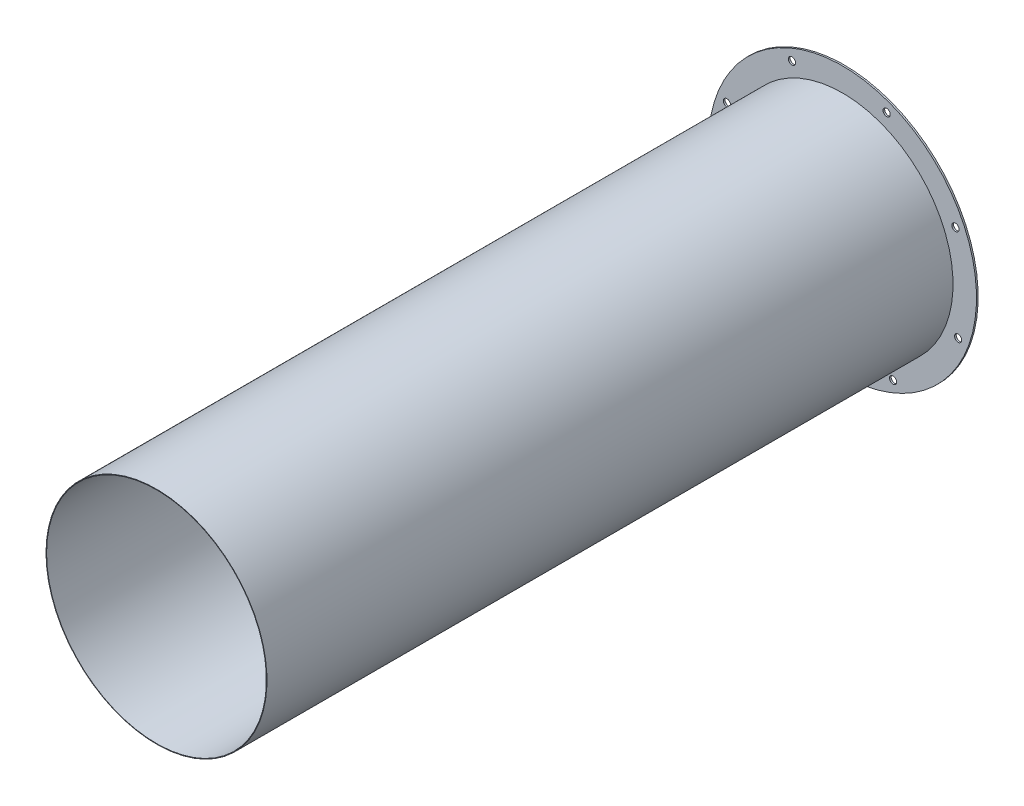
ISO-10303-21;
HEADER;
FILE_DESCRIPTION(('STEP AP214'),'2;1');
FILE_NAME('part.step','',(''),(''),'','','');
FILE_SCHEMA(('AUTOMOTIVE_DESIGN { 1 0 10303 214 1 1 1 1 }'));
ENDSEC;
DATA;
#1=APPLICATION_CONTEXT('core data for automotive mechanical design processes');
#2=APPLICATION_PROTOCOL_DEFINITION('international standard','automotive_design',2000,#1);
#3=PRODUCT_CONTEXT('',#1,'mechanical');
#4=PRODUCT('Part','Part','',(#3));
#5=PRODUCT_RELATED_PRODUCT_CATEGORY('part','',(#4));
#6=PRODUCT_DEFINITION_FORMATION('','',#4);
#7=PRODUCT_DEFINITION_CONTEXT('part definition',#1,'design');
#8=PRODUCT_DEFINITION('design','',#6,#7);
#9=PRODUCT_DEFINITION_SHAPE('','',#8);
#10=(LENGTH_UNIT() NAMED_UNIT(*) SI_UNIT(.MILLI.,.METRE.));
#11=(NAMED_UNIT(*) PLANE_ANGLE_UNIT() SI_UNIT($,.RADIAN.));
#12=(NAMED_UNIT(*) SI_UNIT($,.STERADIAN.) SOLID_ANGLE_UNIT());
#13=UNCERTAINTY_MEASURE_WITH_UNIT(LENGTH_MEASURE(1.E-05),#10,'distance_accuracy_value','');
#14=(GEOMETRIC_REPRESENTATION_CONTEXT(3) GLOBAL_UNCERTAINTY_ASSIGNED_CONTEXT((#13)) GLOBAL_UNIT_ASSIGNED_CONTEXT((#10,
#11,#12)) REPRESENTATION_CONTEXT('',''));
#15=CARTESIAN_POINT('',(0.,0.,0.));
#16=DIRECTION('',(0.,0.,1.));
#17=DIRECTION('',(1.,0.,0.));
#18=AXIS2_PLACEMENT_3D('',#15,#16,#17);
#19=CARTESIAN_POINT('',(0.,0.,-619.5));
#20=DIRECTION('',(0.,0.,-1.));
#21=DIRECTION('',(-1.,0.,0.));
#22=AXIS2_PLACEMENT_3D('',#19,#20,#21);
#23=CYLINDRICAL_SURFACE('',#22,242.5);
#24=CARTESIAN_POINT('',(0.,0.,-619.5));
#25=DIRECTION('',(0.,0.,-1.));
#26=DIRECTION('',(-1.,0.,0.));
#27=AXIS2_PLACEMENT_3D('',#24,#25,#26);
#28=CIRCLE('',#27,242.5);
#29=CARTESIAN_POINT('',(-242.5,0.,-619.5));
#30=VERTEX_POINT('',#29);
#31=EDGE_CURVE('E12',#30,#30,#28,.T.);
#32=ORIENTED_EDGE('',*,*,#31,.T.);
#33=EDGE_LOOP('',(#32));
#34=FACE_BOUND('',#33,.T.);
#35=CARTESIAN_POINT('',(0.,0.,-622.5));
#36=DIRECTION('',(0.,0.,-1.));
#37=DIRECTION('',(-1.,0.,0.));
#38=AXIS2_PLACEMENT_3D('',#35,#36,#37);
#39=CIRCLE('',#38,242.5);
#40=CARTESIAN_POINT('',(-242.5,0.,-622.5));
#41=VERTEX_POINT('',#40);
#42=EDGE_CURVE('E56',#41,#41,#39,.T.);
#43=ORIENTED_EDGE('',*,*,#42,.F.);
#44=EDGE_LOOP('',(#43));
#45=FACE_BOUND('',#44,.T.);
#46=ADVANCED_FACE('F53',(#34,#45),#23,.T.);
#47=CARTESIAN_POINT('',(0.,0.,-619.5));
#48=DIRECTION('',(0.,0.,-1.));
#49=DIRECTION('',(-1.,0.,0.));
#50=AXIS2_PLACEMENT_3D('',#47,#48,#49);
#51=PLANE('',#50);
#52=CARTESIAN_POINT('',(204.446578929114,91.5292104422541,-619.5));
#53=DIRECTION('',(0.,0.,1.));
#54=DIRECTION('',(0.707106781186556,0.707106781186539,0.));
#55=AXIS2_PLACEMENT_3D('',#52,#53,#54);
#56=CIRCLE('',#55,6.50000000000002);
#57=CARTESIAN_POINT('',(209.042773006827,96.1254045199666,-619.5));
#58=VERTEX_POINT('',#57);
#59=EDGE_CURVE('E113',#58,#58,#56,.T.);
#60=ORIENTED_EDGE('',*,*,#59,.F.);
#61=EDGE_LOOP('',(#60));
#62=FACE_BOUND('',#61,.T.);
#63=CARTESIAN_POINT('',(79.8446369707984,209.286487731536,-619.5));
#64=DIRECTION('',(0.,0.,1.));
#65=DIRECTION('',(0.,1.,0.));
#66=AXIS2_PLACEMENT_3D('',#63,#64,#65);
#67=CIRCLE('',#66,6.50000000000002);
#68=CARTESIAN_POINT('',(79.8446369707984,215.786487731536,-619.5));
#69=VERTEX_POINT('',#68);
#70=EDGE_CURVE('E107',#69,#69,#67,.T.);
#71=ORIENTED_EDGE('',*,*,#70,.F.);
#72=EDGE_LOOP('',(#71));
#73=FACE_BOUND('',#72,.T.);
#74=CARTESIAN_POINT('',(-91.5292104422549,204.446578929114,-619.5));
#75=DIRECTION('',(0.,0.,1.));
#76=DIRECTION('',(-0.707106781186542,0.707106781186554,0.));
#77=AXIS2_PLACEMENT_3D('',#74,#75,#76);
#78=CIRCLE('',#77,6.50000000000002);
#79=CARTESIAN_POINT('',(-96.1254045199674,209.042773006826,-619.5));
#80=VERTEX_POINT('',#79);
#81=EDGE_CURVE('E101',#80,#80,#78,.T.);
#82=ORIENTED_EDGE('',*,*,#81,.F.);
#83=EDGE_LOOP('',(#82));
#84=FACE_BOUND('',#83,.T.);
#85=CARTESIAN_POINT('',(-209.286487731537,79.8446369707962,-619.5));
#86=DIRECTION('',(0.,0.,1.));
#87=DIRECTION('',(-1.,0.,0.));
#88=AXIS2_PLACEMENT_3D('',#85,#86,#87);
#89=CIRCLE('',#88,6.50000000000002);
#90=CARTESIAN_POINT('',(-215.786487731537,79.8446369707962,-619.5));
#91=VERTEX_POINT('',#90);
#92=EDGE_CURVE('E95',#91,#91,#89,.T.);
#93=ORIENTED_EDGE('',*,*,#92,.F.);
#94=EDGE_LOOP('',(#93));
#95=FACE_BOUND('',#94,.T.);
#96=CARTESIAN_POINT('',(-204.446578929113,-91.5292104422556,-619.5));
#97=DIRECTION('',(0.,0.,1.));
#98=DIRECTION('',(-0.707106781186551,-0.707106781186544,0.));
#99=AXIS2_PLACEMENT_3D('',#96,#97,#98);
#100=CIRCLE('',#99,6.50000000000002);
#101=CARTESIAN_POINT('',(-209.042773006826,-96.1254045199681,-619.5));
#102=VERTEX_POINT('',#101);
#103=EDGE_CURVE('E89',#102,#102,#100,.T.);
#104=ORIENTED_EDGE('',*,*,#103,.F.);
#105=EDGE_LOOP('',(#104));
#106=FACE_BOUND('',#105,.T.);
#107=CARTESIAN_POINT('',(-79.844636970797,-209.286487731536,-619.5));
#108=DIRECTION('',(0.,0.,1.));
#109=DIRECTION('',(0.,-1.,0.));
#110=AXIS2_PLACEMENT_3D('',#107,#108,#109);
#111=CIRCLE('',#110,6.50000000000002);
#112=CARTESIAN_POINT('',(-79.844636970797,-215.786487731536,-619.5));
#113=VERTEX_POINT('',#112);
#114=EDGE_CURVE('E83',#113,#113,#111,.T.);
#115=ORIENTED_EDGE('',*,*,#114,.F.);
#116=EDGE_LOOP('',(#115));
#117=FACE_BOUND('',#116,.T.);
#118=CARTESIAN_POINT('',(91.5292104422563,-204.446578929113,-619.5));
#119=DIRECTION('',(0.,0.,1.));
#120=DIRECTION('',(0.707106781186547,-0.707106781186549,0.));
#121=AXIS2_PLACEMENT_3D('',#118,#119,#120);
#122=CIRCLE('',#121,6.50000000000002);
#123=CARTESIAN_POINT('',(96.1254045199689,-209.042773006826,-619.5));
#124=VERTEX_POINT('',#123);
#125=EDGE_CURVE('E77',#124,#124,#122,.T.);
#126=ORIENTED_EDGE('',*,*,#125,.F.);
#127=EDGE_LOOP('',(#126));
#128=FACE_BOUND('',#127,.T.);
#129=CARTESIAN_POINT('',(209.286487731537,-79.8446369707962,-619.5));
#130=DIRECTION('',(0.,0.,1.));
#131=DIRECTION('',(1.,0.,0.));
#132=AXIS2_PLACEMENT_3D('',#129,#130,#131);
#133=CIRCLE('',#132,6.50000000000002);
#134=CARTESIAN_POINT('',(215.786487731537,-79.8446369707962,-619.5));
#135=VERTEX_POINT('',#134);
#136=EDGE_CURVE('E71',#135,#135,#133,.T.);
#137=ORIENTED_EDGE('',*,*,#136,.F.);
#138=EDGE_LOOP('',(#137));
#139=FACE_BOUND('',#138,.T.);
#140=CARTESIAN_POINT('',(0.,0.,-619.5));
#141=DIRECTION('',(0.,0.,-1.));
#142=DIRECTION('',(-1.,0.,0.));
#143=AXIS2_PLACEMENT_3D('',#140,#141,#142);
#144=CIRCLE('',#143,200.);
#145=CARTESIAN_POINT('',(-200.,0.,-619.5));
#146=VERTEX_POINT('',#145);
#147=EDGE_CURVE('E63',#146,#146,#144,.T.);
#148=ORIENTED_EDGE('',*,*,#147,.T.);
#149=EDGE_LOOP('',(#148));
#150=FACE_BOUND('',#149,.T.);
#151=ORIENTED_EDGE('',*,*,#31,.F.);
#152=EDGE_LOOP('',(#151));
#153=FACE_BOUND('',#152,.T.);
#154=ADVANCED_FACE('F129',(#62,#73,#84,#95,#106,#117,#128,#139,#150,#153),#51,.F.);
#155=CARTESIAN_POINT('',(0.,0.,-622.5));
#156=DIRECTION('',(0.,0.,-1.));
#157=DIRECTION('',(-1.,0.,0.));
#158=AXIS2_PLACEMENT_3D('',#155,#156,#157);
#159=PLANE('',#158);
#160=CARTESIAN_POINT('',(204.446578929114,91.5292104422541,-622.5));
#161=DIRECTION('',(0.,0.,1.));
#162=DIRECTION('',(0.707106781186556,0.707106781186539,0.));
#163=AXIS2_PLACEMENT_3D('',#160,#161,#162);
#164=CIRCLE('',#163,6.50000000000002);
#165=CARTESIAN_POINT('',(209.042773006827,96.1254045199666,-622.5));
#166=VERTEX_POINT('',#165);
#167=EDGE_CURVE('E110',#166,#166,#164,.T.);
#168=ORIENTED_EDGE('',*,*,#167,.T.);
#169=EDGE_LOOP('',(#168));
#170=FACE_BOUND('',#169,.T.);
#171=CARTESIAN_POINT('',(79.8446369707983,209.286487731536,-622.5));
#172=DIRECTION('',(0.,0.,1.));
#173=DIRECTION('',(0.,1.,0.));
#174=AXIS2_PLACEMENT_3D('',#171,#172,#173);
#175=CIRCLE('',#174,6.50000000000002);
#176=CARTESIAN_POINT('',(79.8446369707984,215.786487731536,-622.5));
#177=VERTEX_POINT('',#176);
#178=EDGE_CURVE('E104',#177,#177,#175,.T.);
#179=ORIENTED_EDGE('',*,*,#178,.T.);
#180=EDGE_LOOP('',(#179));
#181=FACE_BOUND('',#180,.T.);
#182=CARTESIAN_POINT('',(-91.5292104422549,204.446578929114,-622.5));
#183=DIRECTION('',(0.,0.,1.));
#184=DIRECTION('',(-0.707106781186542,0.707106781186554,0.));
#185=AXIS2_PLACEMENT_3D('',#182,#183,#184);
#186=CIRCLE('',#185,6.50000000000002);
#187=CARTESIAN_POINT('',(-96.1254045199674,209.042773006826,-622.5));
#188=VERTEX_POINT('',#187);
#189=EDGE_CURVE('E98',#188,#188,#186,.T.);
#190=ORIENTED_EDGE('',*,*,#189,.T.);
#191=EDGE_LOOP('',(#190));
#192=FACE_BOUND('',#191,.T.);
#193=CARTESIAN_POINT('',(-209.286487731537,79.8446369707962,-622.5));
#194=DIRECTION('',(0.,0.,1.));
#195=DIRECTION('',(-1.,0.,0.));
#196=AXIS2_PLACEMENT_3D('',#193,#194,#195);
#197=CIRCLE('',#196,6.50000000000002);
#198=CARTESIAN_POINT('',(-215.786487731537,79.8446369707962,-622.5));
#199=VERTEX_POINT('',#198);
#200=EDGE_CURVE('E92',#199,#199,#197,.T.);
#201=ORIENTED_EDGE('',*,*,#200,.T.);
#202=EDGE_LOOP('',(#201));
#203=FACE_BOUND('',#202,.T.);
#204=CARTESIAN_POINT('',(-204.446578929113,-91.5292104422556,-622.5));
#205=DIRECTION('',(0.,0.,1.));
#206=DIRECTION('',(-0.707106781186551,-0.707106781186544,0.));
#207=AXIS2_PLACEMENT_3D('',#204,#205,#206);
#208=CIRCLE('',#207,6.50000000000002);
#209=CARTESIAN_POINT('',(-209.042773006826,-96.1254045199681,-622.5));
#210=VERTEX_POINT('',#209);
#211=EDGE_CURVE('E86',#210,#210,#208,.T.);
#212=ORIENTED_EDGE('',*,*,#211,.T.);
#213=EDGE_LOOP('',(#212));
#214=FACE_BOUND('',#213,.T.);
#215=CARTESIAN_POINT('',(-79.844636970797,-209.286487731536,-622.5));
#216=DIRECTION('',(0.,0.,1.));
#217=DIRECTION('',(0.,-1.,0.));
#218=AXIS2_PLACEMENT_3D('',#215,#216,#217);
#219=CIRCLE('',#218,6.50000000000002);
#220=CARTESIAN_POINT('',(-79.844636970797,-215.786487731536,-622.5));
#221=VERTEX_POINT('',#220);
#222=EDGE_CURVE('E80',#221,#221,#219,.T.);
#223=ORIENTED_EDGE('',*,*,#222,.T.);
#224=EDGE_LOOP('',(#223));
#225=FACE_BOUND('',#224,.T.);
#226=CARTESIAN_POINT('',(91.5292104422563,-204.446578929113,-622.5));
#227=DIRECTION('',(0.,0.,1.));
#228=DIRECTION('',(0.707106781186547,-0.707106781186549,0.));
#229=AXIS2_PLACEMENT_3D('',#226,#227,#228);
#230=CIRCLE('',#229,6.50000000000002);
#231=CARTESIAN_POINT('',(96.1254045199689,-209.042773006826,-622.5));
#232=VERTEX_POINT('',#231);
#233=EDGE_CURVE('E74',#232,#232,#230,.T.);
#234=ORIENTED_EDGE('',*,*,#233,.T.);
#235=EDGE_LOOP('',(#234));
#236=FACE_BOUND('',#235,.T.);
#237=CARTESIAN_POINT('',(209.286487731537,-79.8446369707962,-622.5));
#238=DIRECTION('',(0.,0.,1.));
#239=DIRECTION('',(1.,0.,0.));
#240=AXIS2_PLACEMENT_3D('',#237,#238,#239);
#241=CIRCLE('',#240,6.50000000000002);
#242=CARTESIAN_POINT('',(215.786487731537,-79.8446369707962,-622.5));
#243=VERTEX_POINT('',#242);
#244=EDGE_CURVE('E68',#243,#243,#241,.T.);
#245=ORIENTED_EDGE('',*,*,#244,.T.);
#246=EDGE_LOOP('',(#245));
#247=FACE_BOUND('',#246,.T.);
#248=CARTESIAN_POINT('',(0.,0.,-622.5));
#249=DIRECTION('',(0.,0.,-1.));
#250=DIRECTION('',(-1.,0.,0.));
#251=AXIS2_PLACEMENT_3D('',#248,#249,#250);
#252=CIRCLE('',#251,200.);
#253=CARTESIAN_POINT('',(-200.,0.,-622.5));
#254=VERTEX_POINT('',#253);
#255=EDGE_CURVE('E65',#254,#254,#252,.T.);
#256=ORIENTED_EDGE('',*,*,#255,.F.);
#257=EDGE_LOOP('',(#256));
#258=FACE_BOUND('',#257,.T.);
#259=ORIENTED_EDGE('',*,*,#42,.T.);
#260=EDGE_LOOP('',(#259));
#261=FACE_BOUND('',#260,.T.);
#262=ADVANCED_FACE('F119',(#170,#181,#192,#203,#214,#225,#236,#247,#258,#261),#159,.T.);
#263=CARTESIAN_POINT('',(0.,0.,-619.5));
#264=DIRECTION('',(0.,0.,-1.));
#265=DIRECTION('',(-1.,0.,0.));
#266=AXIS2_PLACEMENT_3D('',#263,#264,#265);
#267=CYLINDRICAL_SURFACE('',#266,200.);
#268=ORIENTED_EDGE('',*,*,#147,.F.);
#269=EDGE_LOOP('',(#268));
#270=FACE_BOUND('',#269,.T.);
#271=ORIENTED_EDGE('',*,*,#255,.T.);
#272=EDGE_LOOP('',(#271));
#273=FACE_BOUND('',#272,.T.);
#274=ADVANCED_FACE('F150',(#270,#273),#267,.F.);
#275=CARTESIAN_POINT('',(209.286487731537,-79.8446369707962,-622.5));
#276=DIRECTION('',(0.,0.,1.));
#277=DIRECTION('',(1.,0.,0.));
#278=AXIS2_PLACEMENT_3D('',#275,#276,#277);
#279=CYLINDRICAL_SURFACE('',#278,6.50000000000002);
#280=ORIENTED_EDGE('',*,*,#244,.F.);
#281=EDGE_LOOP('',(#280));
#282=FACE_BOUND('',#281,.T.);
#283=ORIENTED_EDGE('',*,*,#136,.T.);
#284=EDGE_LOOP('',(#283));
#285=FACE_BOUND('',#284,.T.);
#286=ADVANCED_FACE('F153',(#282,#285),#279,.F.);
#287=CARTESIAN_POINT('',(91.5292104422563,-204.446578929113,-622.5));
#288=DIRECTION('',(0.,0.,1.));
#289=DIRECTION('',(1.,0.,0.));
#290=AXIS2_PLACEMENT_3D('',#287,#288,#289);
#291=CYLINDRICAL_SURFACE('',#290,6.50000000000002);
#292=ORIENTED_EDGE('',*,*,#233,.F.);
#293=EDGE_LOOP('',(#292));
#294=FACE_BOUND('',#293,.T.);
#295=ORIENTED_EDGE('',*,*,#125,.T.);
#296=EDGE_LOOP('',(#295));
#297=FACE_BOUND('',#296,.T.);
#298=ADVANCED_FACE('F182',(#294,#297),#291,.F.);
#299=CARTESIAN_POINT('',(-79.844636970797,-209.286487731536,-622.5));
#300=DIRECTION('',(0.,0.,1.));
#301=DIRECTION('',(1.,0.,0.));
#302=AXIS2_PLACEMENT_3D('',#299,#300,#301);
#303=CYLINDRICAL_SURFACE('',#302,6.50000000000002);
#304=ORIENTED_EDGE('',*,*,#222,.F.);
#305=EDGE_LOOP('',(#304));
#306=FACE_BOUND('',#305,.T.);
#307=ORIENTED_EDGE('',*,*,#114,.T.);
#308=EDGE_LOOP('',(#307));
#309=FACE_BOUND('',#308,.T.);
#310=ADVANCED_FACE('F190',(#306,#309),#303,.F.);
#311=CARTESIAN_POINT('',(-204.446578929113,-91.5292104422556,-622.5));
#312=DIRECTION('',(0.,0.,1.));
#313=DIRECTION('',(1.,0.,0.));
#314=AXIS2_PLACEMENT_3D('',#311,#312,#313);
#315=CYLINDRICAL_SURFACE('',#314,6.50000000000002);
#316=ORIENTED_EDGE('',*,*,#211,.F.);
#317=EDGE_LOOP('',(#316));
#318=FACE_BOUND('',#317,.T.);
#319=ORIENTED_EDGE('',*,*,#103,.T.);
#320=EDGE_LOOP('',(#319));
#321=FACE_BOUND('',#320,.T.);
#322=ADVANCED_FACE('F198',(#318,#321),#315,.F.);
#323=CARTESIAN_POINT('',(-209.286487731537,79.8446369707962,-622.5));
#324=DIRECTION('',(0.,0.,1.));
#325=DIRECTION('',(1.,0.,0.));
#326=AXIS2_PLACEMENT_3D('',#323,#324,#325);
#327=CYLINDRICAL_SURFACE('',#326,6.50000000000002);
#328=ORIENTED_EDGE('',*,*,#200,.F.);
#329=EDGE_LOOP('',(#328));
#330=FACE_BOUND('',#329,.T.);
#331=ORIENTED_EDGE('',*,*,#92,.T.);
#332=EDGE_LOOP('',(#331));
#333=FACE_BOUND('',#332,.T.);
#334=ADVANCED_FACE('F206',(#330,#333),#327,.F.);
#335=CARTESIAN_POINT('',(-91.5292104422549,204.446578929114,-622.5));
#336=DIRECTION('',(0.,0.,1.));
#337=DIRECTION('',(1.,0.,0.));
#338=AXIS2_PLACEMENT_3D('',#335,#336,#337);
#339=CYLINDRICAL_SURFACE('',#338,6.50000000000002);
#340=ORIENTED_EDGE('',*,*,#189,.F.);
#341=EDGE_LOOP('',(#340));
#342=FACE_BOUND('',#341,.T.);
#343=ORIENTED_EDGE('',*,*,#81,.T.);
#344=EDGE_LOOP('',(#343));
#345=FACE_BOUND('',#344,.T.);
#346=ADVANCED_FACE('F214',(#342,#345),#339,.F.);
#347=CARTESIAN_POINT('',(79.8446369707983,209.286487731536,-622.5));
#348=DIRECTION('',(0.,0.,1.));
#349=DIRECTION('',(1.,0.,0.));
#350=AXIS2_PLACEMENT_3D('',#347,#348,#349);
#351=CYLINDRICAL_SURFACE('',#350,6.50000000000002);
#352=ORIENTED_EDGE('',*,*,#178,.F.);
#353=EDGE_LOOP('',(#352));
#354=FACE_BOUND('',#353,.T.);
#355=ORIENTED_EDGE('',*,*,#70,.T.);
#356=EDGE_LOOP('',(#355));
#357=FACE_BOUND('',#356,.T.);
#358=ADVANCED_FACE('F125',(#354,#357),#351,.F.);
#359=CARTESIAN_POINT('',(204.446578929114,91.5292104422541,-622.5));
#360=DIRECTION('',(0.,0.,1.));
#361=DIRECTION('',(1.,0.,0.));
#362=AXIS2_PLACEMENT_3D('',#359,#360,#361);
#363=CYLINDRICAL_SURFACE('',#362,6.50000000000002);
#364=ORIENTED_EDGE('',*,*,#167,.F.);
#365=EDGE_LOOP('',(#364));
#366=FACE_BOUND('',#365,.T.);
#367=ORIENTED_EDGE('',*,*,#59,.T.);
#368=EDGE_LOOP('',(#367));
#369=FACE_BOUND('',#368,.T.);
#370=ADVANCED_FACE('F122',(#366,#369),#363,.F.);
#371=CLOSED_SHELL('',(#46,#154,#262,#274,#286,#298,#310,#322,#334,#346,#358,#370));
#372=MANIFOLD_SOLID_BREP('B2',#371);
#373=CARTESIAN_POINT('',(0.,0.,622.5));
#374=DIRECTION('',(0.,0.,1.));
#375=DIRECTION('',(1.,0.,0.));
#376=AXIS2_PLACEMENT_3D('',#373,#374,#375);
#377=PLANE('',#376);
#378=CARTESIAN_POINT('',(0.,0.,622.5));
#379=DIRECTION('',(0.,0.,1.));
#380=DIRECTION('',(1.,0.,0.));
#381=AXIS2_PLACEMENT_3D('',#378,#379,#380);
#382=CIRCLE('',#381,200.);
#383=CARTESIAN_POINT('',(-200.,0.,622.5));
#384=VERTEX_POINT('',#383);
#385=EDGE_CURVE('E52',#384,#384,#382,.T.);
#386=ORIENTED_EDGE('',*,*,#385,.T.);
#387=EDGE_LOOP('',(#386));
#388=FACE_BOUND('',#387,.T.);
#389=CARTESIAN_POINT('',(0.,0.,622.5));
#390=DIRECTION('',(0.,0.,1.));
#391=DIRECTION('',(1.,0.,0.));
#392=AXIS2_PLACEMENT_3D('',#389,#390,#391);
#393=CIRCLE('',#392,199.);
#394=CARTESIAN_POINT('',(-199.,0.,622.5));
#395=VERTEX_POINT('',#394);
#396=EDGE_CURVE('E275',#395,#395,#393,.T.);
#397=ORIENTED_EDGE('',*,*,#396,.F.);
#398=EDGE_LOOP('',(#397));
#399=FACE_BOUND('',#398,.T.);
#400=ADVANCED_FACE('F264',(#388,#399),#377,.T.);
#401=CARTESIAN_POINT('',(0.,0.,-622.5));
#402=DIRECTION('',(0.,0.,1.));
#403=DIRECTION('',(1.,0.,0.));
#404=AXIS2_PLACEMENT_3D('',#401,#402,#403);
#405=PLANE('',#404);
#406=CARTESIAN_POINT('',(0.,0.,-622.5));
#407=DIRECTION('',(0.,0.,1.));
#408=DIRECTION('',(1.,0.,0.));
#409=AXIS2_PLACEMENT_3D('',#406,#407,#408);
#410=CIRCLE('',#409,200.);
#411=CARTESIAN_POINT('',(-200.,0.,-622.5));
#412=VERTEX_POINT('',#411);
#413=EDGE_CURVE('E268',#412,#412,#410,.T.);
#414=ORIENTED_EDGE('',*,*,#413,.F.);
#415=EDGE_LOOP('',(#414));
#416=FACE_BOUND('',#415,.T.);
#417=CARTESIAN_POINT('',(0.,0.,-622.5));
#418=DIRECTION('',(0.,0.,1.));
#419=DIRECTION('',(1.,0.,0.));
#420=AXIS2_PLACEMENT_3D('',#417,#418,#419);
#421=CIRCLE('',#420,199.);
#422=CARTESIAN_POINT('',(-199.,0.,-622.5));
#423=VERTEX_POINT('',#422);
#424=EDGE_CURVE('E277',#423,#423,#421,.T.);
#425=ORIENTED_EDGE('',*,*,#424,.T.);
#426=EDGE_LOOP('',(#425));
#427=FACE_BOUND('',#426,.T.);
#428=ADVANCED_FACE('F287',(#416,#427),#405,.F.);
#429=CARTESIAN_POINT('',(0.,0.,622.5));
#430=DIRECTION('',(0.,0.,-1.));
#431=DIRECTION('',(-1.,0.,0.));
#432=AXIS2_PLACEMENT_3D('',#429,#430,#431);
#433=CYLINDRICAL_SURFACE('',#432,200.);
#434=CARTESIAN_POINT('',(-200.,0.,622.5));
#435=CARTESIAN_POINT('',(-200.,0.,609.53125));
#436=CARTESIAN_POINT('',(-200.,0.,596.5625));
#437=CARTESIAN_POINT('',(-200.,0.,570.625));
#438=CARTESIAN_POINT('',(-200.,0.,557.65625));
#439=CARTESIAN_POINT('',(-200.,0.,531.71875));
#440=CARTESIAN_POINT('',(-200.,0.,518.75));
#441=CARTESIAN_POINT('',(-200.,0.,492.8125));
#442=CARTESIAN_POINT('',(-200.,0.,479.84375));
#443=CARTESIAN_POINT('',(-200.,0.,453.90625));
#444=CARTESIAN_POINT('',(-200.,0.,440.9375));
#445=CARTESIAN_POINT('',(-200.,0.,415.));
#446=CARTESIAN_POINT('',(-200.,0.,402.03125));
#447=CARTESIAN_POINT('',(-200.,0.,376.09375));
#448=CARTESIAN_POINT('',(-200.,0.,363.125));
#449=CARTESIAN_POINT('',(-200.,0.,337.1875));
#450=CARTESIAN_POINT('',(-200.,0.,324.21875));
#451=CARTESIAN_POINT('',(-200.,0.,298.28125));
#452=CARTESIAN_POINT('',(-200.,0.,285.3125));
#453=CARTESIAN_POINT('',(-200.,0.,259.375));
#454=CARTESIAN_POINT('',(-200.,0.,246.40625));
#455=CARTESIAN_POINT('',(-200.,0.,220.46875));
#456=CARTESIAN_POINT('',(-200.,0.,207.5));
#457=CARTESIAN_POINT('',(-200.,0.,181.5625));
#458=CARTESIAN_POINT('',(-200.,0.,168.59375));
#459=CARTESIAN_POINT('',(-200.,0.,142.65625));
#460=CARTESIAN_POINT('',(-200.,0.,129.6875));
#461=CARTESIAN_POINT('',(-200.,0.,103.75));
#462=CARTESIAN_POINT('',(-200.,0.,90.78125));
#463=CARTESIAN_POINT('',(-200.,0.,64.8437500000001));
#464=CARTESIAN_POINT('',(-200.,0.,51.875));
#465=CARTESIAN_POINT('',(-200.,0.,25.9375));
#466=CARTESIAN_POINT('',(-200.,0.,12.96875));
#467=CARTESIAN_POINT('',(-200.,0.,-12.96875));
#468=CARTESIAN_POINT('',(-200.,0.,-25.9375));
#469=CARTESIAN_POINT('',(-200.,0.,-51.875));
#470=CARTESIAN_POINT('',(-200.,0.,-64.84375));
#471=CARTESIAN_POINT('',(-200.,0.,-90.78125));
#472=CARTESIAN_POINT('',(-200.,0.,-103.75));
#473=CARTESIAN_POINT('',(-200.,0.,-129.6875));
#474=CARTESIAN_POINT('',(-200.,0.,-142.65625));
#475=CARTESIAN_POINT('',(-200.,0.,-168.59375));
#476=CARTESIAN_POINT('',(-200.,0.,-181.5625));
#477=CARTESIAN_POINT('',(-200.,0.,-207.5));
#478=CARTESIAN_POINT('',(-200.,0.,-220.46875));
#479=CARTESIAN_POINT('',(-200.,0.,-246.40625));
#480=CARTESIAN_POINT('',(-200.,0.,-259.375));
#481=CARTESIAN_POINT('',(-200.,0.,-285.3125));
#482=CARTESIAN_POINT('',(-200.,0.,-298.28125));
#483=CARTESIAN_POINT('',(-200.,0.,-324.21875));
#484=CARTESIAN_POINT('',(-200.,0.,-337.1875));
#485=CARTESIAN_POINT('',(-200.,0.,-363.125));
#486=CARTESIAN_POINT('',(-200.,0.,-376.09375));
#487=CARTESIAN_POINT('',(-200.,0.,-402.03125));
#488=CARTESIAN_POINT('',(-200.,0.,-415.));
#489=CARTESIAN_POINT('',(-200.,0.,-440.9375));
#490=CARTESIAN_POINT('',(-200.,0.,-453.90625));
#491=CARTESIAN_POINT('',(-200.,0.,-479.84375));
#492=CARTESIAN_POINT('',(-200.,0.,-492.8125));
#493=CARTESIAN_POINT('',(-200.,0.,-518.75));
#494=CARTESIAN_POINT('',(-200.,0.,-531.71875));
#495=CARTESIAN_POINT('',(-200.,0.,-557.65625));
#496=CARTESIAN_POINT('',(-200.,0.,-570.625));
#497=CARTESIAN_POINT('',(-200.,0.,-596.5625));
#498=CARTESIAN_POINT('',(-200.,0.,-609.53125));
#499=CARTESIAN_POINT('',(-200.,0.,-622.5));
#500=B_SPLINE_CURVE_WITH_KNOTS('',3,(#434,#435,#436,#437,#438,#439,#440,#441,#442,#443,#444,
#445,#446,#447,#448,#449,#450,#451,#452,#453,#454,#455,#456,#457,#458,#459,#460,#461,#462,#463,
#464,#465,#466,#467,#468,#469,#470,#471,#472,#473,#474,#475,#476,#477,#478,#479,#480,#481,#482,
#483,#484,#485,#486,#487,#488,#489,#490,#491,#492,#493,#494,#495,#496,#497,#498,#499),
.UNSPECIFIED.,.F.,.F.,(4,2,2,2,2,2,2,2,2,2,2,2,2,2,2,2,2,2,2,2,2,2,2,2,2,2,2,2,2,2,2,2,4),(0.,
38.9062499999999,77.8125,116.71875,155.625,194.53125,233.4375,272.34375,311.25,350.15625,
389.0625,427.96875,466.875,505.78125,544.6875,583.59375,622.5,661.40625,700.3125,739.21875,
778.125,817.03125,855.9375,894.84375,933.75,972.65625,1011.5625,1050.46875,1089.375,1128.28125,
1167.1875,1206.09375,1245.),.UNSPECIFIED.);
#501=EDGE_CURVE('BSEAM266',#384,#412,#500,.T.);
#502=ORIENTED_EDGE('',*,*,#385,.F.);
#503=ORIENTED_EDGE('',*,*,#413,.T.);
#504=ORIENTED_EDGE('',*,*,#501,.T.);
#505=ORIENTED_EDGE('',*,*,#501,.F.);
#506=EDGE_LOOP('',(#502,#504,#503,#505));
#507=FACE_BOUND('',#506,.T.);
#508=ADVANCED_FACE('F266',(#507),#433,.T.);
#509=CARTESIAN_POINT('',(0.,0.,622.5));
#510=DIRECTION('',(0.,0.,-1.));
#511=DIRECTION('',(-1.,0.,0.));
#512=AXIS2_PLACEMENT_3D('',#509,#510,#511);
#513=CYLINDRICAL_SURFACE('',#512,199.);
#514=CARTESIAN_POINT('',(-199.,0.,622.5));
#515=CARTESIAN_POINT('',(-199.,0.,609.53125));
#516=CARTESIAN_POINT('',(-199.,0.,596.5625));
#517=CARTESIAN_POINT('',(-199.,0.,570.625));
#518=CARTESIAN_POINT('',(-199.,0.,557.65625));
#519=CARTESIAN_POINT('',(-199.,0.,531.71875));
#520=CARTESIAN_POINT('',(-199.,0.,518.75));
#521=CARTESIAN_POINT('',(-199.,0.,492.8125));
#522=CARTESIAN_POINT('',(-199.,0.,479.84375));
#523=CARTESIAN_POINT('',(-199.,0.,453.90625));
#524=CARTESIAN_POINT('',(-199.,0.,440.9375));
#525=CARTESIAN_POINT('',(-199.,0.,415.));
#526=CARTESIAN_POINT('',(-199.,0.,402.03125));
#527=CARTESIAN_POINT('',(-199.,0.,376.09375));
#528=CARTESIAN_POINT('',(-199.,0.,363.125));
#529=CARTESIAN_POINT('',(-199.,0.,337.1875));
#530=CARTESIAN_POINT('',(-199.,0.,324.21875));
#531=CARTESIAN_POINT('',(-199.,0.,298.28125));
#532=CARTESIAN_POINT('',(-199.,0.,285.3125));
#533=CARTESIAN_POINT('',(-199.,0.,259.375));
#534=CARTESIAN_POINT('',(-199.,0.,246.40625));
#535=CARTESIAN_POINT('',(-199.,0.,220.46875));
#536=CARTESIAN_POINT('',(-199.,0.,207.5));
#537=CARTESIAN_POINT('',(-199.,0.,181.5625));
#538=CARTESIAN_POINT('',(-199.,0.,168.59375));
#539=CARTESIAN_POINT('',(-199.,0.,142.65625));
#540=CARTESIAN_POINT('',(-199.,0.,129.6875));
#541=CARTESIAN_POINT('',(-199.,0.,103.75));
#542=CARTESIAN_POINT('',(-199.,0.,90.7812500000001));
#543=CARTESIAN_POINT('',(-199.,0.,64.8437500000002));
#544=CARTESIAN_POINT('',(-199.,0.,51.8750000000002));
#545=CARTESIAN_POINT('',(-199.,0.,25.9375000000001));
#546=CARTESIAN_POINT('',(-199.,0.,12.9687500000001));
#547=CARTESIAN_POINT('',(-199.,0.,-12.9687499999999));
#548=CARTESIAN_POINT('',(-199.,0.,-25.9374999999999));
#549=CARTESIAN_POINT('',(-199.,0.,-51.8749999999999));
#550=CARTESIAN_POINT('',(-199.,0.,-64.8437499999999));
#551=CARTESIAN_POINT('',(-199.,0.,-90.7812499999999));
#552=CARTESIAN_POINT('',(-199.,0.,-103.75));
#553=CARTESIAN_POINT('',(-199.,0.,-129.6875));
#554=CARTESIAN_POINT('',(-199.,0.,-142.65625));
#555=CARTESIAN_POINT('',(-199.,0.,-168.59375));
#556=CARTESIAN_POINT('',(-199.,0.,-181.5625));
#557=CARTESIAN_POINT('',(-199.,0.,-207.5));
#558=CARTESIAN_POINT('',(-199.,0.,-220.46875));
#559=CARTESIAN_POINT('',(-199.,0.,-246.40625));
#560=CARTESIAN_POINT('',(-199.,0.,-259.375));
#561=CARTESIAN_POINT('',(-199.,0.,-285.3125));
#562=CARTESIAN_POINT('',(-199.,0.,-298.28125));
#563=CARTESIAN_POINT('',(-199.,0.,-324.21875));
#564=CARTESIAN_POINT('',(-199.,0.,-337.1875));
#565=CARTESIAN_POINT('',(-199.,0.,-363.125));
#566=CARTESIAN_POINT('',(-199.,0.,-376.09375));
#567=CARTESIAN_POINT('',(-199.,0.,-402.03125));
#568=CARTESIAN_POINT('',(-199.,0.,-415.));
#569=CARTESIAN_POINT('',(-199.,0.,-440.9375));
#570=CARTESIAN_POINT('',(-199.,0.,-453.90625));
#571=CARTESIAN_POINT('',(-199.,0.,-479.84375));
#572=CARTESIAN_POINT('',(-199.,0.,-492.8125));
#573=CARTESIAN_POINT('',(-199.,0.,-518.75));
#574=CARTESIAN_POINT('',(-199.,0.,-531.71875));
#575=CARTESIAN_POINT('',(-199.,0.,-557.65625));
#576=CARTESIAN_POINT('',(-199.,0.,-570.625));
#577=CARTESIAN_POINT('',(-199.,0.,-596.5625));
#578=CARTESIAN_POINT('',(-199.,0.,-609.53125));
#579=CARTESIAN_POINT('',(-199.,0.,-622.5));
#580=B_SPLINE_CURVE_WITH_KNOTS('',3,(#514,#515,#516,#517,#518,#519,#520,#521,#522,#523,#524,
#525,#526,#527,#528,#529,#530,#531,#532,#533,#534,#535,#536,#537,#538,#539,#540,#541,#542,#543,
#544,#545,#546,#547,#548,#549,#550,#551,#552,#553,#554,#555,#556,#557,#558,#559,#560,#561,#562,
#563,#564,#565,#566,#567,#568,#569,#570,#571,#572,#573,#574,#575,#576,#577,#578,#579),
.UNSPECIFIED.,.F.,.F.,(4,2,2,2,2,2,2,2,2,2,2,2,2,2,2,2,2,2,2,2,2,2,2,2,2,2,2,2,2,2,2,2,4),(0.,
38.90625,77.8125000000001,116.71875,155.625,194.53125,233.4375,272.34375,311.25,350.15625,
389.0625,427.96875,466.875,505.78125,544.6875,583.59375,622.5,661.40625,700.3125,739.21875,
778.125,817.03125,855.9375,894.84375,933.75,972.65625,1011.5625,1050.46875,1089.375,1128.28125,
1167.1875,1206.09375,1245.),.UNSPECIFIED.);
#581=EDGE_CURVE('BSEAM283',#395,#423,#580,.T.);
#582=ORIENTED_EDGE('',*,*,#396,.T.);
#583=ORIENTED_EDGE('',*,*,#424,.F.);
#584=ORIENTED_EDGE('',*,*,#581,.T.);
#585=ORIENTED_EDGE('',*,*,#581,.F.);
#586=EDGE_LOOP('',(#582,#584,#583,#585));
#587=FACE_BOUND('',#586,.T.);
#588=ADVANCED_FACE('F283',(#587),#513,.F.);
#589=CLOSED_SHELL('',(#400,#428,#508,#588));
#590=MANIFOLD_SOLID_BREP('B7',#589);
#591=ADVANCED_BREP_SHAPE_REPRESENTATION('',(#18,#372,#590),#14);
#592=SHAPE_DEFINITION_REPRESENTATION(#9,#591);
ENDSEC;
END-ISO-10303-21;
